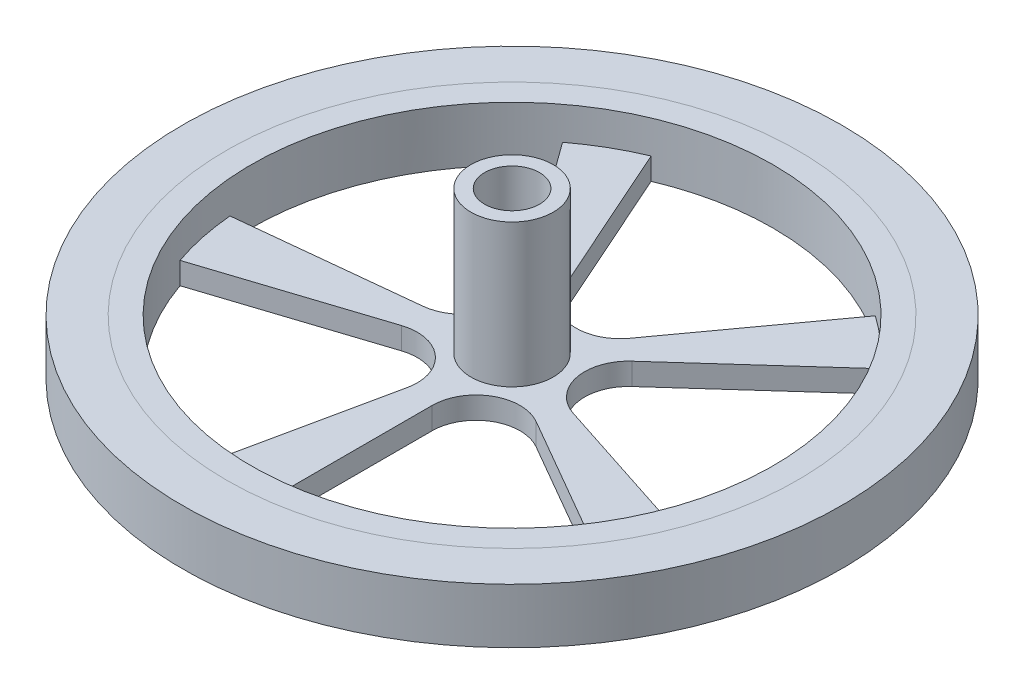
ISO-10303-21;
HEADER;
FILE_DESCRIPTION(('STEP AP214'),'2;1');
FILE_NAME('part.step','',(''),(''),'','','');
FILE_SCHEMA(('AUTOMOTIVE_DESIGN { 1 0 10303 214 1 1 1 1 }'));
ENDSEC;
DATA;
#1=APPLICATION_CONTEXT('core data for automotive mechanical design processes');
#2=APPLICATION_PROTOCOL_DEFINITION('international standard','automotive_design',2000,#1);
#3=PRODUCT_CONTEXT('',#1,'mechanical');
#4=PRODUCT('Part','Part','',(#3));
#5=PRODUCT_RELATED_PRODUCT_CATEGORY('part','',(#4));
#6=PRODUCT_DEFINITION_FORMATION('','',#4);
#7=PRODUCT_DEFINITION_CONTEXT('part definition',#1,'design');
#8=PRODUCT_DEFINITION('design','',#6,#7);
#9=PRODUCT_DEFINITION_SHAPE('','',#8);
#10=(LENGTH_UNIT() NAMED_UNIT(*) SI_UNIT(.MILLI.,.METRE.));
#11=(NAMED_UNIT(*) PLANE_ANGLE_UNIT() SI_UNIT($,.RADIAN.));
#12=(NAMED_UNIT(*) SI_UNIT($,.STERADIAN.) SOLID_ANGLE_UNIT());
#13=UNCERTAINTY_MEASURE_WITH_UNIT(LENGTH_MEASURE(1.E-05),#10,'distance_accuracy_value','');
#14=(GEOMETRIC_REPRESENTATION_CONTEXT(3) GLOBAL_UNCERTAINTY_ASSIGNED_CONTEXT((#13)) GLOBAL_UNIT_ASSIGNED_CONTEXT((#10,
#11,#12)) REPRESENTATION_CONTEXT('',''));
#15=CARTESIAN_POINT('',(0.,0.,0.));
#16=DIRECTION('',(0.,0.,1.));
#17=DIRECTION('',(1.,0.,0.));
#18=AXIS2_PLACEMENT_3D('',#15,#16,#17);
#19=CARTESIAN_POINT('',(30.1625,6.35,0.));
#20=DIRECTION('',(0.,1.,0.));
#21=DIRECTION('',(0.,0.,1.));
#22=AXIS2_PLACEMENT_3D('',#19,#20,#21);
#23=PLANE('',#22);
#24=CARTESIAN_POINT('',(0.,6.35,0.));
#25=DIRECTION('',(0.,-1.,0.));
#26=DIRECTION('',(0.,0.,-1.));
#27=AXIS2_PLACEMENT_3D('',#24,#25,#26);
#28=CIRCLE('',#27,38.1);
#29=CARTESIAN_POINT('',(0.,6.35,-38.1));
#30=VERTEX_POINT('',#29);
#31=EDGE_CURVE('E333',#30,#30,#28,.T.);
#32=ORIENTED_EDGE('',*,*,#31,.F.);
#33=EDGE_LOOP('',(#32));
#34=FACE_BOUND('',#33,.T.);
#35=CARTESIAN_POINT('',(0.,6.35,0.));
#36=DIRECTION('',(0.,1.,0.));
#37=DIRECTION('',(0.,0.,1.));
#38=AXIS2_PLACEMENT_3D('',#35,#36,#37);
#39=CIRCLE('',#38,33.02);
#40=CARTESIAN_POINT('',(0.,6.35,33.02));
#41=VERTEX_POINT('',#40);
#42=EDGE_CURVE('E11',#41,#41,#39,.F.);
#43=ORIENTED_EDGE('',*,*,#42,.T.);
#44=EDGE_LOOP('',(#43));
#45=FACE_BOUND('',#44,.T.);
#46=ADVANCED_FACE('F37',(#34,#45),#23,.T.);
#47=CARTESIAN_POINT('',(38.1,0.,0.));
#48=DIRECTION('',(0.,-1.,0.));
#49=DIRECTION('',(0.,0.,-1.));
#50=AXIS2_PLACEMENT_3D('',#47,#48,#49);
#51=PLANE('',#50);
#52=CARTESIAN_POINT('',(0.,0.,0.));
#53=DIRECTION('',(0.,-1.,0.));
#54=DIRECTION('',(0.,0.,-1.));
#55=AXIS2_PLACEMENT_3D('',#52,#53,#54);
#56=CIRCLE('',#55,38.1);
#57=CARTESIAN_POINT('',(0.,0.,-38.1));
#58=VERTEX_POINT('',#57);
#59=EDGE_CURVE('E330',#58,#58,#56,.T.);
#60=ORIENTED_EDGE('',*,*,#59,.T.);
#61=EDGE_LOOP('',(#60));
#62=FACE_BOUND('',#61,.T.);
#63=CARTESIAN_POINT('',(0.,0.,0.));
#64=DIRECTION('',(0.,-1.,0.));
#65=DIRECTION('',(0.,0.,-1.));
#66=AXIS2_PLACEMENT_3D('',#63,#64,#65);
#67=CIRCLE('',#66,33.02);
#68=CARTESIAN_POINT('',(0.,0.,-33.02));
#69=VERTEX_POINT('',#68);
#70=EDGE_CURVE('E41',#69,#69,#67,.F.);
#71=ORIENTED_EDGE('',*,*,#70,.T.);
#72=EDGE_LOOP('',(#71));
#73=FACE_BOUND('',#72,.T.);
#74=ADVANCED_FACE('F353',(#62,#73),#51,.T.);
#75=ORIENTED_EDGE('',*,*,#42,.F.);
#76=EDGE_LOOP('',(#75));
#77=FACE_BOUND('',#76,.T.);
#78=CARTESIAN_POINT('',(0.,6.35,0.));
#79=DIRECTION('',(0.,-1.,0.));
#80=DIRECTION('',(0.,0.,-1.));
#81=AXIS2_PLACEMENT_3D('',#78,#79,#80);
#82=CIRCLE('',#81,30.1625);
#83=CARTESIAN_POINT('',(0.,6.35,-30.1625));
#84=VERTEX_POINT('',#83);
#85=EDGE_CURVE('E310',#84,#84,#82,.T.);
#86=ORIENTED_EDGE('',*,*,#85,.T.);
#87=EDGE_LOOP('',(#86));
#88=FACE_BOUND('',#87,.T.);
#89=ADVANCED_FACE('F39',(#77,#88),#23,.T.);
#90=CARTESIAN_POINT('',(0.,0.,0.));
#91=DIRECTION('',(0.,-1.,0.));
#92=DIRECTION('',(0.,0.,-1.));
#93=AXIS2_PLACEMENT_3D('',#90,#91,#92);
#94=CYLINDRICAL_SURFACE('',#93,38.1);
#95=ORIENTED_EDGE('',*,*,#31,.T.);
#96=EDGE_LOOP('',(#95));
#97=FACE_BOUND('',#96,.T.);
#98=ORIENTED_EDGE('',*,*,#59,.F.);
#99=EDGE_LOOP('',(#98));
#100=FACE_BOUND('',#99,.T.);
#101=ADVANCED_FACE('F358',(#97,#100),#94,.T.);
#102=ORIENTED_EDGE('',*,*,#70,.F.);
#103=EDGE_LOOP('',(#102));
#104=FACE_BOUND('',#103,.T.);
#105=DIRECTION('',(0.95105651629515,0.,-0.309016994374958));
#106=VECTOR('',#105,1.);
#107=CARTESIAN_POINT('',(-28.4954397418532,0.,9.88869658592151));
#108=LINE('',#107,#106);
#109=CARTESIAN_POINT('',(-28.4954397418532,0.,9.88869658592151));
#110=VERTEX_POINT('',#109);
#111=CARTESIAN_POINT('',(-9.16997133073571,0.,3.60947126022236));
#112=VERTEX_POINT('',#111);
#113=EDGE_CURVE('E53',#110,#112,#108,.T.);
#114=ORIENTED_EDGE('',*,*,#113,.F.);
#115=CARTESIAN_POINT('',(0.,0.,0.));
#116=DIRECTION('',(0.,1.,0.));
#117=DIRECTION('',(-0.95105651629515,0.,0.309016994374958));
#118=AXIS2_PLACEMENT_3D('',#115,#116,#117);
#119=CIRCLE('',#118,30.1625);
#120=CARTESIAN_POINT('',(-6.85594074499977,0.,29.3729889992669));
#121=VERTEX_POINT('',#120);
#122=EDGE_CURVE('E237',#110,#121,#119,.T.);
#123=ORIENTED_EDGE('',*,*,#122,.T.);
#124=DIRECTION('',(0.207911690817746,0.,-0.978147600733809));
#125=VECTOR('',#124,1.);
#126=CARTESIAN_POINT('',(-6.85594074499977,0.,29.3729889992669));
#127=LINE('',#126,#125);
#128=CARTESIAN_POINT('',(-2.63117518758317,0.,9.49702975235587));
#129=VERTEX_POINT('',#128);
#130=EDGE_CURVE('E234',#121,#129,#127,.T.);
#131=ORIENTED_EDGE('',*,*,#130,.T.);
#132=CARTESIAN_POINT('',(-7.60016499931092,0.,8.44083836300172));
#133=DIRECTION('',(0.,-1.,0.));
#134=DIRECTION('',(0.95105651629515,0.,-0.309016994374958));
#135=AXIS2_PLACEMENT_3D('',#132,#133,#134);
#136=CIRCLE('',#135,5.08);
#137=EDGE_CURVE('E231',#112,#129,#136,.T.);
#138=ORIENTED_EDGE('',*,*,#137,.F.);
#139=EDGE_LOOP('',(#114,#123,#131,#138));
#140=FACE_BOUND('',#139,.T.);
#141=DIRECTION('',(-0.587785252292468,0.,0.809016994374951));
#142=VECTOR('',#141,1.);
#143=CARTESIAN_POINT('',(17.240864995747,0.,-24.749322828078));
#144=LINE('',#143,#142);
#145=CARTESIAN_POINT('',(17.240864995747,0.,-24.749322828078));
#146=VERTEX_POINT('',#145);
#147=CARTESIAN_POINT('',(5.29706866916406,0.,-8.31009750237905));
#148=VERTEX_POINT('',#147);
#149=EDGE_CURVE('E61',#146,#148,#144,.T.);
#150=ORIENTED_EDGE('',*,*,#149,.F.);
#151=CARTESIAN_POINT('',(0.,0.,0.));
#152=DIRECTION('',(0.,1.,0.));
#153=DIRECTION('',(0.587785252292469,0.,-0.809016994374951));
#154=AXIS2_PLACEMENT_3D('',#151,#152,#153);
#155=CIRCLE('',#154,30.1625);
#156=CARTESIAN_POINT('',(-11.7184371743855,0.,-27.7930681364973));
#157=VERTEX_POINT('',#156);
#158=EDGE_CURVE('E218',#146,#157,#155,.T.);
#159=ORIENTED_EDGE('',*,*,#158,.T.);
#160=DIRECTION('',(0.406736643075808,0.,0.913545457642598));
#161=VECTOR('',#160,1.);
#162=CARTESIAN_POINT('',(-11.7184371743855,0.,-27.7930681364973));
#163=LINE('',#162,#161);
#164=CARTESIAN_POINT('',(-3.45354858708509,0.,-9.22982443719969));
#165=VERTEX_POINT('',#164);
#166=EDGE_CURVE('E215',#157,#165,#163,.T.);
#167=ORIENTED_EDGE('',*,*,#166,.T.);
#168=CARTESIAN_POINT('',(1.18726233773931,0.,-11.2960465840248));
#169=DIRECTION('',(0.,-1.,0.));
#170=DIRECTION('',(-0.587785252292469,0.,0.809016994374951));
#171=AXIS2_PLACEMENT_3D('',#168,#169,#170);
#172=CIRCLE('',#171,5.08);
#173=EDGE_CURVE('E212',#148,#165,#172,.T.);
#174=ORIENTED_EDGE('',*,*,#173,.F.);
#175=EDGE_LOOP('',(#150,#159,#167,#174));
#176=FACE_BOUND('',#175,.T.);
#177=DIRECTION('',(0.58778525229248,0.,0.809016994374942));
#178=VECTOR('',#177,1.);
#179=CARTESIAN_POINT('',(-18.2102844681261,0.,-24.0449983539181));
#180=LINE('',#179,#178);
#181=CARTESIAN_POINT('',(-18.2102844681261,0.,-24.0449983539181));
#182=VERTEX_POINT('',#181);
#183=CARTESIAN_POINT('',(-6.26648814154292,0.,-7.60577302821928));
#184=VERTEX_POINT('',#183);
#185=EDGE_CURVE('E197',#182,#184,#180,.T.);
#186=ORIENTED_EDGE('',*,*,#185,.F.);
#187=CARTESIAN_POINT('',(0.,0.,0.));
#188=DIRECTION('',(0.,1.,0.));
#189=DIRECTION('',(-0.58778525229248,0.,-0.809016994374942));
#190=AXIS2_PLACEMENT_3D('',#187,#188,#189);
#191=CIRCLE('',#190,30.1625);
#192=CARTESIAN_POINT('',(-30.0539747934512,0.,2.55636565549628));
#193=VERTEX_POINT('',#192);
#194=EDGE_CURVE('E202',#182,#193,#191,.T.);
#195=ORIENTED_EDGE('',*,*,#194,.T.);
#196=DIRECTION('',(0.994521895368272,0.,-0.104528463267665));
#197=VECTOR('',#196,1.);
#198=CARTESIAN_POINT('',(-30.0539747934512,0.,2.55636565549628));
#199=LINE('',#198,#197);
#200=CARTESIAN_POINT('',(-9.84528987956789,0.,0.432347281897338));
#201=VERTEX_POINT('',#200);
#202=EDGE_CURVE('E181',#193,#201,#199,.T.);
#203=ORIENTED_EDGE('',*,*,#202,.T.);
#204=CARTESIAN_POINT('',(-10.3762944729676,0.,-4.61982394657348));
#205=DIRECTION('',(0.,-1.,0.));
#206=DIRECTION('',(0.58778525229248,0.,0.809016994374942));
#207=AXIS2_PLACEMENT_3D('',#204,#205,#206);
#208=CIRCLE('',#207,5.08);
#209=EDGE_CURVE('E192',#184,#201,#208,.T.);
#210=ORIENTED_EDGE('',*,*,#209,.F.);
#211=EDGE_LOOP('',(#186,#195,#203,#210));
#212=FACE_BOUND('',#211,.T.);
#213=DIRECTION('',(-0.951056516295155,0.,-0.309016994374945));
#214=VECTOR('',#213,1.);
#215=CARTESIAN_POINT('',(28.865725030946,0.,8.74907564762234));
#216=LINE('',#215,#214);
#217=CARTESIAN_POINT('',(28.865725030946,0.,8.74907564762234));
#218=VERTEX_POINT('',#217);
#219=CARTESIAN_POINT('',(9.54025661982845,0.,2.46985032192347));
#220=VERTEX_POINT('',#219);
#221=EDGE_CURVE('E224',#218,#220,#216,.T.);
#222=ORIENTED_EDGE('',*,*,#221,.F.);
#223=CARTESIAN_POINT('',(0.,0.,0.));
#224=DIRECTION('',(0.,1.,0.));
#225=DIRECTION('',(0.951056516295155,0.,0.309016994374945));
#226=AXIS2_PLACEMENT_3D('',#223,#224,#225);
#227=CIRCLE('',#226,30.1625);
#228=CARTESIAN_POINT('',(22.8115823246507,0.,-19.7334264154931));
#229=VERTEX_POINT('',#228);
#230=EDGE_CURVE('E255',#218,#229,#227,.T.);
#231=ORIENTED_EDGE('',*,*,#230,.T.);
#232=DIRECTION('',(-0.743144825477391,0.,0.669130606358862));
#233=VECTOR('',#232,1.);
#234=CARTESIAN_POINT('',(22.8115823246507,0.,-19.7334264154931));
#235=LINE('',#234,#233);
#236=CARTESIAN_POINT('',(7.71087947095015,0.,-6.13669249428106));
#237=VERTEX_POINT('',#236);
#238=EDGE_CURVE('E252',#229,#237,#235,.T.);
#239=ORIENTED_EDGE('',*,*,#238,.T.);
#240=CARTESIAN_POINT('',(11.1100629512532,0.,-2.36151678085592));
#241=DIRECTION('',(0.,-1.,0.));
#242=DIRECTION('',(-0.951056516295155,0.,-0.309016994374945));
#243=AXIS2_PLACEMENT_3D('',#240,#241,#242);
#244=CIRCLE('',#243,5.08);
#245=EDGE_CURVE('E249',#220,#237,#244,.T.);
#246=ORIENTED_EDGE('',*,*,#245,.F.);
#247=EDGE_LOOP('',(#222,#231,#239,#246));
#248=FACE_BOUND('',#247,.T.);
#249=DIRECTION('',(0.,0.,-1.));
#250=VECTOR('',#249,1.);
#251=CARTESIAN_POINT('',(0.599134183286061,0.,30.1565489484526));
#252=LINE('',#251,#250);
#253=CARTESIAN_POINT('',(0.599134183286061,0.,30.1565489484526));
#254=VERTEX_POINT('',#253);
#255=CARTESIAN_POINT('',(0.599134183286058,0.,9.83654894845261));
#256=VERTEX_POINT('',#255);
#257=EDGE_CURVE('E285',#254,#256,#252,.T.);
#258=ORIENTED_EDGE('',*,*,#257,.F.);
#259=CARTESIAN_POINT('',(0.,0.,0.));
#260=DIRECTION('',(0.,1.,0.));
#261=DIRECTION('',(0.,0.,1.));
#262=AXIS2_PLACEMENT_3D('',#259,#260,#261);
#263=CIRCLE('',#262,30.1625);
#264=CARTESIAN_POINT('',(25.8167703881859,0.,15.5971398972276));
#265=VERTEX_POINT('',#264);
#266=EDGE_CURVE('E293',#254,#265,#263,.T.);
#267=ORIENTED_EDGE('',*,*,#266,.T.);
#268=DIRECTION('',(-0.86602540378444,0.,-0.499999999999998));
#269=VECTOR('',#268,1.);
#270=CARTESIAN_POINT('',(25.8167703881859,0.,15.5971398972276));
#271=LINE('',#270,#269);
#272=CARTESIAN_POINT('',(8.21913418328605,0.,5.43713989722766));
#273=VERTEX_POINT('',#272);
#274=EDGE_CURVE('E290',#265,#273,#271,.T.);
#275=ORIENTED_EDGE('',*,*,#274,.T.);
#276=CARTESIAN_POINT('',(5.67913418328606,0.,9.83654894845261));
#277=DIRECTION('',(0.,-1.,0.));
#278=DIRECTION('',(0.,0.,-1.));
#279=AXIS2_PLACEMENT_3D('',#276,#277,#278);
#280=CIRCLE('',#279,5.08);
#281=EDGE_CURVE('E287',#256,#273,#280,.T.);
#282=ORIENTED_EDGE('',*,*,#281,.F.);
#283=EDGE_LOOP('',(#258,#267,#275,#282));
#284=FACE_BOUND('',#283,.T.);
#285=ADVANCED_FACE('F199',(#104,#140,#176,#212,#248,#284),#51,.T.);
#286=CARTESIAN_POINT('',(0.,6.35,0.));
#287=DIRECTION('',(0.,1.,0.));
#288=DIRECTION('',(0.,0.,1.));
#289=AXIS2_PLACEMENT_3D('',#286,#287,#288);
#290=PLANE('',#289);
#291=CARTESIAN_POINT('',(0.,6.35,0.));
#292=DIRECTION('',(0.,-1.,0.));
#293=DIRECTION('',(0.,0.,-1.));
#294=AXIS2_PLACEMENT_3D('',#291,#292,#293);
#295=CIRCLE('',#294,3.175);
#296=CARTESIAN_POINT('',(0.,6.35,-3.175));
#297=VERTEX_POINT('',#296);
#298=EDGE_CURVE('E327',#297,#297,#295,.T.);
#299=ORIENTED_EDGE('',*,*,#298,.F.);
#300=EDGE_LOOP('',(#299));
#301=FACE_BOUND('',#300,.T.);
#302=ADVANCED_FACE('F357',(#301),#290,.T.);
#303=CARTESIAN_POINT('',(0.,0.,0.));
#304=DIRECTION('',(0.,-1.,0.));
#305=DIRECTION('',(0.,0.,-1.));
#306=AXIS2_PLACEMENT_3D('',#303,#304,#305);
#307=CYLINDRICAL_SURFACE('',#306,3.175);
#308=ORIENTED_EDGE('',*,*,#298,.T.);
#309=EDGE_LOOP('',(#308));
#310=FACE_BOUND('',#309,.T.);
#311=CARTESIAN_POINT('',(0.,19.05,0.));
#312=DIRECTION('',(0.,-1.,0.));
#313=DIRECTION('',(0.,0.,-1.));
#314=AXIS2_PLACEMENT_3D('',#311,#312,#313);
#315=CIRCLE('',#314,3.175);
#316=CARTESIAN_POINT('',(0.,19.05,-3.175));
#317=VERTEX_POINT('',#316);
#318=EDGE_CURVE('E324',#317,#317,#315,.T.);
#319=ORIENTED_EDGE('',*,*,#318,.F.);
#320=EDGE_LOOP('',(#319));
#321=FACE_BOUND('',#320,.T.);
#322=ADVANCED_FACE('F468',(#310,#321),#307,.F.);
#323=CARTESIAN_POINT('',(3.175,19.05,0.));
#324=DIRECTION('',(0.,1.,0.));
#325=DIRECTION('',(0.,0.,1.));
#326=AXIS2_PLACEMENT_3D('',#323,#324,#325);
#327=PLANE('',#326);
#328=ORIENTED_EDGE('',*,*,#318,.T.);
#329=EDGE_LOOP('',(#328));
#330=FACE_BOUND('',#329,.T.);
#331=CARTESIAN_POINT('',(0.,19.05,0.));
#332=DIRECTION('',(0.,-1.,0.));
#333=DIRECTION('',(0.,0.,-1.));
#334=AXIS2_PLACEMENT_3D('',#331,#332,#333);
#335=CIRCLE('',#334,4.7625);
#336=CARTESIAN_POINT('',(0.,19.05,-4.7625));
#337=VERTEX_POINT('',#336);
#338=EDGE_CURVE('E321',#337,#337,#335,.T.);
#339=ORIENTED_EDGE('',*,*,#338,.F.);
#340=EDGE_LOOP('',(#339));
#341=FACE_BOUND('',#340,.T.);
#342=ADVANCED_FACE('F464',(#330,#341),#327,.T.);
#343=CARTESIAN_POINT('',(0.,0.,0.));
#344=DIRECTION('',(0.,-1.,0.));
#345=DIRECTION('',(0.,0.,-1.));
#346=AXIS2_PLACEMENT_3D('',#343,#344,#345);
#347=CYLINDRICAL_SURFACE('',#346,4.7625);
#348=ORIENTED_EDGE('',*,*,#338,.T.);
#349=EDGE_LOOP('',(#348));
#350=FACE_BOUND('',#349,.T.);
#351=CARTESIAN_POINT('',(0.,2.54,0.));
#352=DIRECTION('',(0.,-1.,0.));
#353=DIRECTION('',(0.,0.,-1.));
#354=AXIS2_PLACEMENT_3D('',#351,#352,#353);
#355=CIRCLE('',#354,4.7625);
#356=CARTESIAN_POINT('',(0.,2.54,-4.7625));
#357=VERTEX_POINT('',#356);
#358=EDGE_CURVE('E317',#357,#357,#355,.T.);
#359=ORIENTED_EDGE('',*,*,#358,.F.);
#360=EDGE_LOOP('',(#359));
#361=FACE_BOUND('',#360,.T.);
#362=ADVANCED_FACE('F458',(#350,#361),#347,.T.);
#363=CARTESIAN_POINT('',(4.7625,2.54,0.));
#364=DIRECTION('',(0.,1.,0.));
#365=DIRECTION('',(0.,0.,1.));
#366=AXIS2_PLACEMENT_3D('',#363,#364,#365);
#367=PLANE('',#366);
#368=DIRECTION('',(-0.95105651629515,0.,0.309016994374958));
#369=VECTOR('',#368,1.);
#370=CARTESIAN_POINT('',(4.49286436240167,2.54,-0.829853162872117));
#371=LINE('',#370,#369);
#372=CARTESIAN_POINT('',(-9.16997133073571,2.54,3.60947126022236));
#373=VERTEX_POINT('',#372);
#374=CARTESIAN_POINT('',(-28.4954397418532,2.54,9.88869658592151));
#375=VERTEX_POINT('',#374);
#376=EDGE_CURVE('E283',#373,#375,#371,.T.);
#377=ORIENTED_EDGE('',*,*,#376,.F.);
#378=CARTESIAN_POINT('',(-7.60016499931092,2.54,8.44083836300172));
#379=DIRECTION('',(0.,1.,0.));
#380=DIRECTION('',(0.,0.,1.));
#381=AXIS2_PLACEMENT_3D('',#378,#379,#380);
#382=CIRCLE('',#381,5.08);
#383=CARTESIAN_POINT('',(-2.63117518758317,2.54,9.49702975235587));
#384=VERTEX_POINT('',#383);
#385=EDGE_CURVE('E344',#384,#373,#382,.T.);
#386=ORIENTED_EDGE('',*,*,#385,.F.);
#387=DIRECTION('',(-0.207911690817746,0.,0.978147600733809));
#388=VECTOR('',#387,1.);
#389=CARTESIAN_POINT('',(-0.380171784910338,2.54,-1.0931086323979));
#390=LINE('',#389,#388);
#391=CARTESIAN_POINT('',(-6.85594074499977,2.54,29.3729889992669));
#392=VERTEX_POINT('',#391);
#393=EDGE_CURVE('E280',#384,#392,#390,.T.);
#394=ORIENTED_EDGE('',*,*,#393,.T.);
#395=CARTESIAN_POINT('',(0.,2.54,0.));
#396=DIRECTION('',(0.,-1.,0.));
#397=DIRECTION('',(0.,0.,-1.));
#398=AXIS2_PLACEMENT_3D('',#395,#396,#397);
#399=CIRCLE('',#398,30.1625);
#400=CARTESIAN_POINT('',(0.599134183286061,2.54,30.1565489484526));
#401=VERTEX_POINT('',#400);
#402=EDGE_CURVE('E314',#401,#392,#399,.T.);
#403=ORIENTED_EDGE('',*,*,#402,.F.);
#404=DIRECTION('',(0.,0.,1.));
#405=VECTOR('',#404,1.);
#406=CARTESIAN_POINT('',(0.599134183286058,2.54,0.));
#407=LINE('',#406,#405);
#408=CARTESIAN_POINT('',(0.599134183286058,2.54,9.83654894845261));
#409=VERTEX_POINT('',#408);
#410=EDGE_CURVE('E308',#409,#401,#407,.T.);
#411=ORIENTED_EDGE('',*,*,#410,.F.);
#412=CARTESIAN_POINT('',(5.67913418328606,2.54,9.83654894845261));
#413=DIRECTION('',(0.,1.,0.));
#414=DIRECTION('',(0.,0.,1.));
#415=AXIS2_PLACEMENT_3D('',#412,#413,#414);
#416=CIRCLE('',#415,5.08);
#417=CARTESIAN_POINT('',(8.21913418328605,2.54,5.43713989722766));
#418=VERTEX_POINT('',#417);
#419=EDGE_CURVE('E336',#418,#409,#416,.T.);
#420=ORIENTED_EDGE('',*,*,#419,.F.);
#421=DIRECTION('',(0.86602540378444,0.,0.499999999999998));
#422=VECTOR('',#421,1.);
#423=CARTESIAN_POINT('',(3.27230790835698,2.54,2.58108841576306));
#424=LINE('',#423,#422);
#425=CARTESIAN_POINT('',(25.8167703881859,2.54,15.5971398972276));
#426=VERTEX_POINT('',#425);
#427=EDGE_CURVE('E299',#418,#426,#424,.T.);
#428=ORIENTED_EDGE('',*,*,#427,.T.);
#429=CARTESIAN_POINT('',(28.865725030946,2.54,8.74907564762234));
#430=VERTEX_POINT('',#429);
#431=EDGE_CURVE('E313',#430,#426,#399,.T.);
#432=ORIENTED_EDGE('',*,*,#431,.F.);
#433=DIRECTION('',(0.951056516295155,0.,0.309016994374945));
#434=VECTOR('',#433,1.);
#435=CARTESIAN_POINT('',(4.4928643624017,2.54,0.829853162872061));
#436=LINE('',#435,#434);
#437=CARTESIAN_POINT('',(9.54025661982845,2.54,2.46985032192347));
#438=VERTEX_POINT('',#437);
#439=EDGE_CURVE('E270',#438,#430,#436,.T.);
#440=ORIENTED_EDGE('',*,*,#439,.F.);
#441=CARTESIAN_POINT('',(11.1100629512532,2.54,-2.36151678085592));
#442=DIRECTION('',(0.,1.,0.));
#443=DIRECTION('',(0.,0.,1.));
#444=AXIS2_PLACEMENT_3D('',#441,#442,#443);
#445=CIRCLE('',#444,5.08);
#446=CARTESIAN_POINT('',(7.71087947095015,2.54,-6.13669249428106));
#447=VERTEX_POINT('',#446);
#448=EDGE_CURVE('E338',#447,#438,#445,.T.);
#449=ORIENTED_EDGE('',*,*,#448,.F.);
#450=DIRECTION('',(0.743144825477391,0.,-0.669130606358862));
#451=VECTOR('',#450,1.);
#452=CARTESIAN_POINT('',(3.0310574225086,2.54,-1.92296179527005));
#453=LINE('',#452,#451);
#454=CARTESIAN_POINT('',(22.8115823246507,2.54,-19.7334264154931));
#455=VERTEX_POINT('',#454);
#456=EDGE_CURVE('E261',#447,#455,#453,.T.);
#457=ORIENTED_EDGE('',*,*,#456,.T.);
#458=CARTESIAN_POINT('',(17.240864995747,2.54,-24.749322828078));
#459=VERTEX_POINT('',#458);
#460=EDGE_CURVE('E378',#459,#455,#399,.T.);
#461=ORIENTED_EDGE('',*,*,#460,.F.);
#462=DIRECTION('',(0.587785252292468,0.,-0.809016994374951));
#463=VECTOR('',#462,1.);
#464=CARTESIAN_POINT('',(1.16069354595526,2.54,-2.61686556650766));
#465=LINE('',#464,#463);
#466=CARTESIAN_POINT('',(5.29706866916406,2.54,-8.31009750237905));
#467=VERTEX_POINT('',#466);
#468=EDGE_CURVE('E278',#467,#459,#465,.T.);
#469=ORIENTED_EDGE('',*,*,#468,.F.);
#470=CARTESIAN_POINT('',(1.18726233773931,2.54,-11.2960465840248));
#471=DIRECTION('',(0.,1.,0.));
#472=DIRECTION('',(0.,0.,1.));
#473=AXIS2_PLACEMENT_3D('',#470,#471,#472);
#474=CIRCLE('',#473,5.08);
#475=CARTESIAN_POINT('',(-3.45354858708509,2.54,-9.22982443719969));
#476=VERTEX_POINT('',#475);
#477=EDGE_CURVE('E342',#476,#467,#474,.T.);
#478=ORIENTED_EDGE('',*,*,#477,.F.);
#479=DIRECTION('',(-0.406736643075808,0.,-0.913545457642598));
#480=VECTOR('',#479,1.);
#481=CARTESIAN_POINT('',(1.33521905526739,2.54,1.52592378920633));
#482=LINE('',#481,#480);
#483=CARTESIAN_POINT('',(-11.7184371743855,2.54,-27.7930681364973));
#484=VERTEX_POINT('',#483);
#485=EDGE_CURVE('E275',#476,#484,#482,.T.);
#486=ORIENTED_EDGE('',*,*,#485,.T.);
#487=CARTESIAN_POINT('',(-18.2102844681261,2.54,-24.0449983539181));
#488=VERTEX_POINT('',#487);
#489=EDGE_CURVE('E382',#488,#484,#399,.T.);
#490=ORIENTED_EDGE('',*,*,#489,.F.);
#491=DIRECTION('',(-0.58778525229248,0.,-0.809016994374942));
#492=VECTOR('',#491,1.);
#493=CARTESIAN_POINT('',(1.16069354595533,2.54,2.61686556650769));
#494=LINE('',#493,#492);
#495=CARTESIAN_POINT('',(-6.26648814154292,2.54,-7.60577302821928));
#496=VERTEX_POINT('',#495);
#497=EDGE_CURVE('E273',#496,#488,#494,.T.);
#498=ORIENTED_EDGE('',*,*,#497,.F.);
#499=CARTESIAN_POINT('',(-10.3762944729676,2.54,-4.61982394657348));
#500=DIRECTION('',(0.,1.,0.));
#501=DIRECTION('',(0.,0.,1.));
#502=AXIS2_PLACEMENT_3D('',#499,#500,#501);
#503=CIRCLE('',#502,5.08);
#504=CARTESIAN_POINT('',(-9.84528987956789,2.54,0.432347281897338));
#505=VERTEX_POINT('',#504);
#506=EDGE_CURVE('E340',#505,#496,#503,.T.);
#507=ORIENTED_EDGE('',*,*,#506,.F.);
#508=DIRECTION('',(-0.994521895368272,0.,0.104528463267665));
#509=VECTOR('',#508,1.);
#510=CARTESIAN_POINT('',(4.64783739877735,2.54,-1.09094177730142));
#511=LINE('',#510,#509);
#512=CARTESIAN_POINT('',(-30.0539747934512,2.54,2.55636565549628));
#513=VERTEX_POINT('',#512);
#514=EDGE_CURVE('E184',#505,#513,#511,.T.);
#515=ORIENTED_EDGE('',*,*,#514,.T.);
#516=EDGE_CURVE('E318',#375,#513,#399,.T.);
#517=ORIENTED_EDGE('',*,*,#516,.F.);
#518=EDGE_LOOP('',(#377,#386,#394,#403,#411,#420,#428,#432,#440,#449,#457,#461,#469,#478,#486,
#490,#498,#507,#515,#517));
#519=FACE_BOUND('',#518,.T.);
#520=ORIENTED_EDGE('',*,*,#358,.T.);
#521=EDGE_LOOP('',(#520));
#522=FACE_BOUND('',#521,.T.);
#523=ADVANCED_FACE('F375',(#519,#522),#367,.T.);
#524=CARTESIAN_POINT('',(0.,0.,0.));
#525=DIRECTION('',(0.,-1.,0.));
#526=DIRECTION('',(0.,0.,-1.));
#527=AXIS2_PLACEMENT_3D('',#524,#525,#526);
#528=CYLINDRICAL_SURFACE('',#527,30.1625);
#529=ORIENTED_EDGE('',*,*,#85,.F.);
#530=EDGE_LOOP('',(#529));
#531=FACE_BOUND('',#530,.T.);
#532=ORIENTED_EDGE('',*,*,#402,.T.);
#533=DIRECTION('',(0.,-1.,0.));
#534=VECTOR('',#533,1.);
#535=CARTESIAN_POINT('',(-6.85594074499977,19.05,29.3729889992669));
#536=LINE('',#535,#534);
#537=EDGE_CURVE('E243',#392,#121,#536,.T.);
#538=ORIENTED_EDGE('',*,*,#537,.T.);
#539=ORIENTED_EDGE('',*,*,#122,.F.);
#540=DIRECTION('',(0.,-1.,0.));
#541=VECTOR('',#540,1.);
#542=CARTESIAN_POINT('',(-28.4954397418532,19.05,9.88869658592151));
#543=LINE('',#542,#541);
#544=EDGE_CURVE('E241',#375,#110,#543,.T.);
#545=ORIENTED_EDGE('',*,*,#544,.F.);
#546=ORIENTED_EDGE('',*,*,#516,.T.);
#547=DIRECTION('',(0.,-1.,0.));
#548=VECTOR('',#547,1.);
#549=CARTESIAN_POINT('',(-30.0539747934512,19.05,2.55636565549628));
#550=LINE('',#549,#548);
#551=EDGE_CURVE('E187',#513,#193,#550,.T.);
#552=ORIENTED_EDGE('',*,*,#551,.T.);
#553=ORIENTED_EDGE('',*,*,#194,.F.);
#554=DIRECTION('',(0.,-1.,0.));
#555=VECTOR('',#554,1.);
#556=CARTESIAN_POINT('',(-18.2102844681261,19.05,-24.0449983539181));
#557=LINE('',#556,#555);
#558=EDGE_CURVE('E207',#488,#182,#557,.T.);
#559=ORIENTED_EDGE('',*,*,#558,.F.);
#560=ORIENTED_EDGE('',*,*,#489,.T.);
#561=DIRECTION('',(0.,-1.,0.));
#562=VECTOR('',#561,1.);
#563=CARTESIAN_POINT('',(-11.7184371743855,19.05,-27.7930681364973));
#564=LINE('',#563,#562);
#565=EDGE_CURVE('E225',#484,#157,#564,.T.);
#566=ORIENTED_EDGE('',*,*,#565,.T.);
#567=ORIENTED_EDGE('',*,*,#158,.F.);
#568=DIRECTION('',(0.,-1.,0.));
#569=VECTOR('',#568,1.);
#570=CARTESIAN_POINT('',(17.240864995747,19.05,-24.749322828078));
#571=LINE('',#570,#569);
#572=EDGE_CURVE('E222',#459,#146,#571,.T.);
#573=ORIENTED_EDGE('',*,*,#572,.F.);
#574=ORIENTED_EDGE('',*,*,#460,.T.);
#575=DIRECTION('',(0.,-1.,0.));
#576=VECTOR('',#575,1.);
#577=CARTESIAN_POINT('',(22.8115823246507,19.05,-19.7334264154931));
#578=LINE('',#577,#576);
#579=EDGE_CURVE('E262',#455,#229,#578,.T.);
#580=ORIENTED_EDGE('',*,*,#579,.T.);
#581=ORIENTED_EDGE('',*,*,#230,.F.);
#582=DIRECTION('',(0.,-1.,0.));
#583=VECTOR('',#582,1.);
#584=CARTESIAN_POINT('',(28.865725030946,19.05,8.74907564762234));
#585=LINE('',#584,#583);
#586=EDGE_CURVE('E259',#430,#218,#585,.T.);
#587=ORIENTED_EDGE('',*,*,#586,.F.);
#588=ORIENTED_EDGE('',*,*,#431,.T.);
#589=DIRECTION('',(0.,-1.,0.));
#590=VECTOR('',#589,1.);
#591=CARTESIAN_POINT('',(25.8167703881859,19.05,15.5971398972276));
#592=LINE('',#591,#590);
#593=EDGE_CURVE('E300',#426,#265,#592,.T.);
#594=ORIENTED_EDGE('',*,*,#593,.T.);
#595=ORIENTED_EDGE('',*,*,#266,.F.);
#596=DIRECTION('',(0.,-1.,0.));
#597=VECTOR('',#596,1.);
#598=CARTESIAN_POINT('',(0.599134183286061,19.05,30.1565489484526));
#599=LINE('',#598,#597);
#600=EDGE_CURVE('E297',#401,#254,#599,.T.);
#601=ORIENTED_EDGE('',*,*,#600,.F.);
#602=EDGE_LOOP('',(#532,#538,#539,#545,#546,#552,#553,#559,#560,#566,#567,#573,#574,#580,#581,
#587,#588,#594,#595,#601));
#603=FACE_BOUND('',#602,.T.);
#604=ADVANCED_FACE('F387',(#531,#603),#528,.F.);
#605=CARTESIAN_POINT('',(0.599134183286061,19.05,30.1565489484526));
#606=DIRECTION('',(-1.,0.,0.));
#607=DIRECTION('',(0.,0.,1.));
#608=AXIS2_PLACEMENT_3D('',#605,#606,#607);
#609=PLANE('',#608);
#610=ORIENTED_EDGE('',*,*,#410,.T.);
#611=ORIENTED_EDGE('',*,*,#600,.T.);
#612=ORIENTED_EDGE('',*,*,#257,.T.);
#613=DIRECTION('',(0.,-1.,0.));
#614=VECTOR('',#613,1.);
#615=CARTESIAN_POINT('',(0.599134183286058,19.05,9.83654894845261));
#616=LINE('',#615,#614);
#617=EDGE_CURVE('E296',#409,#256,#616,.T.);
#618=ORIENTED_EDGE('',*,*,#617,.F.);
#619=EDGE_LOOP('',(#610,#611,#612,#618));
#620=FACE_BOUND('',#619,.T.);
#621=ADVANCED_FACE('F403',(#620),#609,.F.);
#622=CARTESIAN_POINT('',(25.8167703881859,19.05,15.5971398972276));
#623=DIRECTION('',(-0.499999999999998,0.,0.86602540378444));
#624=DIRECTION('',(0.86602540378444,0.,0.499999999999998));
#625=AXIS2_PLACEMENT_3D('',#622,#623,#624);
#626=PLANE('',#625);
#627=DIRECTION('',(0.,-1.,0.));
#628=VECTOR('',#627,1.);
#629=CARTESIAN_POINT('',(8.21913418328605,19.05,5.43713989722766));
#630=LINE('',#629,#628);
#631=EDGE_CURVE('E302',#418,#273,#630,.T.);
#632=ORIENTED_EDGE('',*,*,#631,.T.);
#633=ORIENTED_EDGE('',*,*,#274,.F.);
#634=ORIENTED_EDGE('',*,*,#593,.F.);
#635=ORIENTED_EDGE('',*,*,#427,.F.);
#636=EDGE_LOOP('',(#632,#633,#634,#635));
#637=FACE_BOUND('',#636,.T.);
#638=ADVANCED_FACE('F394',(#637),#626,.T.);
#639=CARTESIAN_POINT('',(5.67913418328606,19.05,9.83654894845261));
#640=DIRECTION('',(0.,-1.,0.));
#641=DIRECTION('',(0.,0.,-1.));
#642=AXIS2_PLACEMENT_3D('',#639,#640,#641);
#643=CYLINDRICAL_SURFACE('',#642,5.08);
#644=ORIENTED_EDGE('',*,*,#419,.T.);
#645=ORIENTED_EDGE('',*,*,#617,.T.);
#646=ORIENTED_EDGE('',*,*,#281,.T.);
#647=ORIENTED_EDGE('',*,*,#631,.F.);
#648=EDGE_LOOP('',(#644,#645,#646,#647));
#649=FACE_BOUND('',#648,.T.);
#650=ADVANCED_FACE('F400',(#649),#643,.F.);
#651=CARTESIAN_POINT('',(28.865725030946,19.05,8.74907564762234));
#652=DIRECTION('',(-0.309016994374945,0.,0.951056516295155));
#653=DIRECTION('',(0.951056516295155,0.,0.309016994374945));
#654=AXIS2_PLACEMENT_3D('',#651,#652,#653);
#655=PLANE('',#654);
#656=ORIENTED_EDGE('',*,*,#439,.T.);
#657=ORIENTED_EDGE('',*,*,#586,.T.);
#658=ORIENTED_EDGE('',*,*,#221,.T.);
#659=DIRECTION('',(0.,-1.,0.));
#660=VECTOR('',#659,1.);
#661=CARTESIAN_POINT('',(9.54025661982845,19.05,2.46985032192347));
#662=LINE('',#661,#660);
#663=EDGE_CURVE('E258',#438,#220,#662,.T.);
#664=ORIENTED_EDGE('',*,*,#663,.F.);
#665=EDGE_LOOP('',(#656,#657,#658,#664));
#666=FACE_BOUND('',#665,.T.);
#667=ADVANCED_FACE('F521',(#666),#655,.F.);
#668=CARTESIAN_POINT('',(22.8115823246507,19.05,-19.7334264154931));
#669=DIRECTION('',(0.669130606358862,0.,0.743144825477391));
#670=DIRECTION('',(0.743144825477391,0.,-0.669130606358862));
#671=AXIS2_PLACEMENT_3D('',#668,#669,#670);
#672=PLANE('',#671);
#673=DIRECTION('',(0.,-1.,0.));
#674=VECTOR('',#673,1.);
#675=CARTESIAN_POINT('',(7.71087947095015,19.05,-6.13669249428106));
#676=LINE('',#675,#674);
#677=EDGE_CURVE('E264',#447,#237,#676,.T.);
#678=ORIENTED_EDGE('',*,*,#677,.T.);
#679=ORIENTED_EDGE('',*,*,#238,.F.);
#680=ORIENTED_EDGE('',*,*,#579,.F.);
#681=ORIENTED_EDGE('',*,*,#456,.F.);
#682=EDGE_LOOP('',(#678,#679,#680,#681));
#683=FACE_BOUND('',#682,.T.);
#684=ADVANCED_FACE('F525',(#683),#672,.T.);
#685=CARTESIAN_POINT('',(11.1100629512532,19.05,-2.36151678085592));
#686=DIRECTION('',(0.,-1.,0.));
#687=DIRECTION('',(0.,0.,-1.));
#688=AXIS2_PLACEMENT_3D('',#685,#686,#687);
#689=CYLINDRICAL_SURFACE('',#688,5.08);
#690=ORIENTED_EDGE('',*,*,#448,.T.);
#691=ORIENTED_EDGE('',*,*,#663,.T.);
#692=ORIENTED_EDGE('',*,*,#245,.T.);
#693=ORIENTED_EDGE('',*,*,#677,.F.);
#694=EDGE_LOOP('',(#690,#691,#692,#693));
#695=FACE_BOUND('',#694,.T.);
#696=ADVANCED_FACE('F535',(#695),#689,.F.);
#697=CARTESIAN_POINT('',(-18.2102844681261,19.05,-24.0449983539181));
#698=DIRECTION('',(0.809016994374942,0.,-0.58778525229248));
#699=DIRECTION('',(-0.58778525229248,0.,-0.809016994374942));
#700=AXIS2_PLACEMENT_3D('',#697,#698,#699);
#701=PLANE('',#700);
#702=ORIENTED_EDGE('',*,*,#497,.T.);
#703=ORIENTED_EDGE('',*,*,#558,.T.);
#704=ORIENTED_EDGE('',*,*,#185,.T.);
#705=DIRECTION('',(0.,-1.,0.));
#706=VECTOR('',#705,1.);
#707=CARTESIAN_POINT('',(-6.26648814154292,19.05,-7.60577302821928));
#708=LINE('',#707,#706);
#709=EDGE_CURVE('E188',#496,#184,#708,.T.);
#710=ORIENTED_EDGE('',*,*,#709,.F.);
#711=EDGE_LOOP('',(#702,#703,#704,#710));
#712=FACE_BOUND('',#711,.T.);
#713=ADVANCED_FACE('F420',(#712),#701,.F.);
#714=CARTESIAN_POINT('',(-30.0539747934512,19.05,2.55636565549628));
#715=DIRECTION('',(-0.104528463267665,0.,-0.994521895368272));
#716=DIRECTION('',(-0.994521895368272,0.,0.104528463267665));
#717=AXIS2_PLACEMENT_3D('',#714,#715,#716);
#718=PLANE('',#717);
#719=DIRECTION('',(0.,-1.,0.));
#720=VECTOR('',#719,1.);
#721=CARTESIAN_POINT('',(-9.84528987956789,19.05,0.432347281897338));
#722=LINE('',#721,#720);
#723=EDGE_CURVE('E177',#505,#201,#722,.T.);
#724=ORIENTED_EDGE('',*,*,#723,.T.);
#725=ORIENTED_EDGE('',*,*,#202,.F.);
#726=ORIENTED_EDGE('',*,*,#551,.F.);
#727=ORIENTED_EDGE('',*,*,#514,.F.);
#728=EDGE_LOOP('',(#724,#725,#726,#727));
#729=FACE_BOUND('',#728,.T.);
#730=ADVANCED_FACE('F179',(#729),#718,.T.);
#731=CARTESIAN_POINT('',(-10.3762944729676,19.05,-4.61982394657348));
#732=DIRECTION('',(0.,-1.,0.));
#733=DIRECTION('',(0.,0.,-1.));
#734=AXIS2_PLACEMENT_3D('',#731,#732,#733);
#735=CYLINDRICAL_SURFACE('',#734,5.08);
#736=ORIENTED_EDGE('',*,*,#506,.T.);
#737=ORIENTED_EDGE('',*,*,#709,.T.);
#738=ORIENTED_EDGE('',*,*,#209,.T.);
#739=ORIENTED_EDGE('',*,*,#723,.F.);
#740=EDGE_LOOP('',(#736,#737,#738,#739));
#741=FACE_BOUND('',#740,.T.);
#742=ADVANCED_FACE('F193',(#741),#735,.F.);
#743=CARTESIAN_POINT('',(17.240864995747,19.05,-24.749322828078));
#744=DIRECTION('',(0.809016994374951,0.,0.587785252292468));
#745=DIRECTION('',(0.587785252292468,0.,-0.809016994374951));
#746=AXIS2_PLACEMENT_3D('',#743,#744,#745);
#747=PLANE('',#746);
#748=ORIENTED_EDGE('',*,*,#468,.T.);
#749=ORIENTED_EDGE('',*,*,#572,.T.);
#750=ORIENTED_EDGE('',*,*,#149,.T.);
#751=DIRECTION('',(0.,-1.,0.));
#752=VECTOR('',#751,1.);
#753=CARTESIAN_POINT('',(5.29706866916406,19.05,-8.31009750237905));
#754=LINE('',#753,#752);
#755=EDGE_CURVE('E221',#467,#148,#754,.T.);
#756=ORIENTED_EDGE('',*,*,#755,.F.);
#757=EDGE_LOOP('',(#748,#749,#750,#756));
#758=FACE_BOUND('',#757,.T.);
#759=ADVANCED_FACE('F370',(#758),#747,.F.);
#760=CARTESIAN_POINT('',(-11.7184371743855,19.05,-27.7930681364973));
#761=DIRECTION('',(0.913545457642598,0.,-0.406736643075808));
#762=DIRECTION('',(-0.406736643075808,0.,-0.913545457642598));
#763=AXIS2_PLACEMENT_3D('',#760,#761,#762);
#764=PLANE('',#763);
#765=DIRECTION('',(0.,-1.,0.));
#766=VECTOR('',#765,1.);
#767=CARTESIAN_POINT('',(-3.45354858708509,19.05,-9.22982443719969));
#768=LINE('',#767,#766);
#769=EDGE_CURVE('E227',#476,#165,#768,.T.);
#770=ORIENTED_EDGE('',*,*,#769,.T.);
#771=ORIENTED_EDGE('',*,*,#166,.F.);
#772=ORIENTED_EDGE('',*,*,#565,.F.);
#773=ORIENTED_EDGE('',*,*,#485,.F.);
#774=EDGE_LOOP('',(#770,#771,#772,#773));
#775=FACE_BOUND('',#774,.T.);
#776=ADVANCED_FACE('F423',(#775),#764,.T.);
#777=CARTESIAN_POINT('',(1.18726233773931,19.05,-11.2960465840248));
#778=DIRECTION('',(0.,-1.,0.));
#779=DIRECTION('',(0.,0.,-1.));
#780=AXIS2_PLACEMENT_3D('',#777,#778,#779);
#781=CYLINDRICAL_SURFACE('',#780,5.08);
#782=ORIENTED_EDGE('',*,*,#477,.T.);
#783=ORIENTED_EDGE('',*,*,#755,.T.);
#784=ORIENTED_EDGE('',*,*,#173,.T.);
#785=ORIENTED_EDGE('',*,*,#769,.F.);
#786=EDGE_LOOP('',(#782,#783,#784,#785));
#787=FACE_BOUND('',#786,.T.);
#788=ADVANCED_FACE('F366',(#787),#781,.F.);
#789=CARTESIAN_POINT('',(-28.4954397418532,19.05,9.88869658592151));
#790=DIRECTION('',(-0.309016994374958,0.,-0.95105651629515));
#791=DIRECTION('',(-0.95105651629515,0.,0.309016994374958));
#792=AXIS2_PLACEMENT_3D('',#789,#790,#791);
#793=PLANE('',#792);
#794=ORIENTED_EDGE('',*,*,#376,.T.);
#795=ORIENTED_EDGE('',*,*,#544,.T.);
#796=ORIENTED_EDGE('',*,*,#113,.T.);
#797=DIRECTION('',(0.,-1.,0.));
#798=VECTOR('',#797,1.);
#799=CARTESIAN_POINT('',(-9.16997133073571,19.05,3.60947126022236));
#800=LINE('',#799,#798);
#801=EDGE_CURVE('E240',#373,#112,#800,.T.);
#802=ORIENTED_EDGE('',*,*,#801,.F.);
#803=EDGE_LOOP('',(#794,#795,#796,#802));
#804=FACE_BOUND('',#803,.T.);
#805=ADVANCED_FACE('F416',(#804),#793,.F.);
#806=CARTESIAN_POINT('',(-6.85594074499977,19.05,29.3729889992669));
#807=DIRECTION('',(-0.978147600733809,0.,-0.207911690817746));
#808=DIRECTION('',(-0.207911690817746,0.,0.978147600733809));
#809=AXIS2_PLACEMENT_3D('',#806,#807,#808);
#810=PLANE('',#809);
#811=DIRECTION('',(0.,-1.,0.));
#812=VECTOR('',#811,1.);
#813=CARTESIAN_POINT('',(-2.63117518758317,19.05,9.49702975235587));
#814=LINE('',#813,#812);
#815=EDGE_CURVE('E245',#384,#129,#814,.T.);
#816=ORIENTED_EDGE('',*,*,#815,.T.);
#817=ORIENTED_EDGE('',*,*,#130,.F.);
#818=ORIENTED_EDGE('',*,*,#537,.F.);
#819=ORIENTED_EDGE('',*,*,#393,.F.);
#820=EDGE_LOOP('',(#816,#817,#818,#819));
#821=FACE_BOUND('',#820,.T.);
#822=ADVANCED_FACE('F409',(#821),#810,.T.);
#823=CARTESIAN_POINT('',(-7.60016499931092,19.05,8.44083836300172));
#824=DIRECTION('',(0.,-1.,0.));
#825=DIRECTION('',(0.,0.,-1.));
#826=AXIS2_PLACEMENT_3D('',#823,#824,#825);
#827=CYLINDRICAL_SURFACE('',#826,5.08);
#828=ORIENTED_EDGE('',*,*,#385,.T.);
#829=ORIENTED_EDGE('',*,*,#801,.T.);
#830=ORIENTED_EDGE('',*,*,#137,.T.);
#831=ORIENTED_EDGE('',*,*,#815,.F.);
#832=EDGE_LOOP('',(#828,#829,#830,#831));
#833=FACE_BOUND('',#832,.T.);
#834=ADVANCED_FACE('F415',(#833),#827,.F.);
#835=CLOSED_SHELL('',(#46,#74,#89,#101,#285,#302,#322,#342,#362,#523,#604,#621,#638,#650,#667,
#684,#696,#713,#730,#742,#759,#776,#788,#805,#822,#834));
#836=MANIFOLD_SOLID_BREP('B2',#835);
#837=ADVANCED_BREP_SHAPE_REPRESENTATION('',(#18,#836),#14);
#838=SHAPE_DEFINITION_REPRESENTATION(#9,#837);
ENDSEC;
END-ISO-10303-21;
